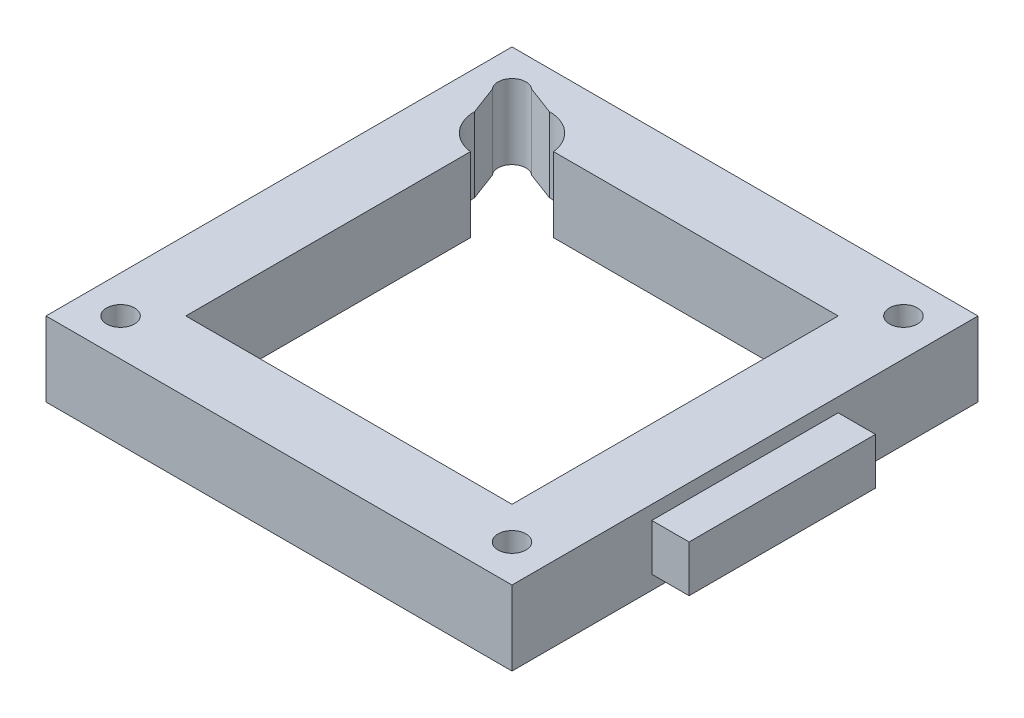
ISO-10303-21;
HEADER;
FILE_DESCRIPTION(('STEP AP214'),'2;1');
FILE_NAME('part.step','',(''),(''),'','','');
FILE_SCHEMA(('AUTOMOTIVE_DESIGN { 1 0 10303 214 1 1 1 1 }'));
ENDSEC;
DATA;
#1=APPLICATION_CONTEXT('core data for automotive mechanical design processes');
#2=APPLICATION_PROTOCOL_DEFINITION('international standard','automotive_design',2000,#1);
#3=PRODUCT_CONTEXT('',#1,'mechanical');
#4=PRODUCT('Part','Part','',(#3));
#5=PRODUCT_RELATED_PRODUCT_CATEGORY('part','',(#4));
#6=PRODUCT_DEFINITION_FORMATION('','',#4);
#7=PRODUCT_DEFINITION_CONTEXT('part definition',#1,'design');
#8=PRODUCT_DEFINITION('design','',#6,#7);
#9=PRODUCT_DEFINITION_SHAPE('','',#8);
#10=(LENGTH_UNIT() NAMED_UNIT(*) SI_UNIT(.MILLI.,.METRE.));
#11=(NAMED_UNIT(*) PLANE_ANGLE_UNIT() SI_UNIT($,.RADIAN.));
#12=(NAMED_UNIT(*) SI_UNIT($,.STERADIAN.) SOLID_ANGLE_UNIT());
#13=UNCERTAINTY_MEASURE_WITH_UNIT(LENGTH_MEASURE(1.E-05),#10,'distance_accuracy_value','');
#14=(GEOMETRIC_REPRESENTATION_CONTEXT(3) GLOBAL_UNCERTAINTY_ASSIGNED_CONTEXT((#13)) GLOBAL_UNIT_ASSIGNED_CONTEXT((#10,
#11,#12)) REPRESENTATION_CONTEXT('',''));
#15=CARTESIAN_POINT('',(0.,0.,0.));
#16=DIRECTION('',(0.,0.,1.));
#17=DIRECTION('',(1.,0.,0.));
#18=AXIS2_PLACEMENT_3D('',#15,#16,#17);
#19=CARTESIAN_POINT('',(25.,8.,0.));
#20=DIRECTION('',(-1.,0.,0.));
#21=DIRECTION('',(0.,0.,1.));
#22=AXIS2_PLACEMENT_3D('',#19,#20,#21);
#23=PLANE('',#22);
#24=DIRECTION('',(0.,0.,-1.));
#25=VECTOR('',#24,1.);
#26=CARTESIAN_POINT('',(25.,0.,0.));
#27=LINE('',#26,#25);
#28=CARTESIAN_POINT('',(25.,0.,25.));
#29=VERTEX_POINT('',#28);
#30=CARTESIAN_POINT('',(25.,0.,-25.));
#31=VERTEX_POINT('',#30);
#32=EDGE_CURVE('E369',#29,#31,#27,.T.);
#33=ORIENTED_EDGE('',*,*,#32,.T.);
#34=DIRECTION('',(0.,-1.,0.));
#35=VECTOR('',#34,1.);
#36=CARTESIAN_POINT('',(25.,8.,-25.));
#37=LINE('',#36,#35);
#38=CARTESIAN_POINT('',(25.,8.,-25.));
#39=VERTEX_POINT('',#38);
#40=EDGE_CURVE('E59',#39,#31,#37,.T.);
#41=ORIENTED_EDGE('',*,*,#40,.F.);
#42=DIRECTION('',(0.,0.,-1.));
#43=VECTOR('',#42,1.);
#44=CARTESIAN_POINT('',(25.,8.,0.));
#45=LINE('',#44,#43);
#46=CARTESIAN_POINT('',(25.,8.,25.));
#47=VERTEX_POINT('',#46);
#48=EDGE_CURVE('E309',#47,#39,#45,.T.);
#49=ORIENTED_EDGE('',*,*,#48,.F.);
#50=DIRECTION('',(0.,-1.,0.));
#51=VECTOR('',#50,1.);
#52=CARTESIAN_POINT('',(25.,8.,25.));
#53=LINE('',#52,#51);
#54=EDGE_CURVE('E11',#47,#29,#53,.T.);
#55=ORIENTED_EDGE('',*,*,#54,.T.);
#56=EDGE_LOOP('',(#33,#41,#49,#55));
#57=FACE_BOUND('',#56,.T.);
#58=DIRECTION('',(0.,0.,-1.));
#59=VECTOR('',#58,1.);
#60=CARTESIAN_POINT('',(25.,1.50000000000004,0.));
#61=LINE('',#60,#59);
#62=CARTESIAN_POINT('',(25.,1.5,10.));
#63=VERTEX_POINT('',#62);
#64=CARTESIAN_POINT('',(25.,1.50000000000007,-10.));
#65=VERTEX_POINT('',#64);
#66=EDGE_CURVE('E67',#63,#65,#61,.T.);
#67=ORIENTED_EDGE('',*,*,#66,.F.);
#68=DIRECTION('',(0.,-1.,0.));
#69=VECTOR('',#68,1.);
#70=CARTESIAN_POINT('',(25.,8.,10.));
#71=LINE('',#70,#69);
#72=CARTESIAN_POINT('',(25.,6.5,10.));
#73=VERTEX_POINT('',#72);
#74=EDGE_CURVE('E71',#73,#63,#71,.T.);
#75=ORIENTED_EDGE('',*,*,#74,.F.);
#76=DIRECTION('',(0.,0.,1.));
#77=VECTOR('',#76,1.);
#78=CARTESIAN_POINT('',(25.,6.5,0.));
#79=LINE('',#78,#77);
#80=CARTESIAN_POINT('',(25.,6.5,-10.));
#81=VERTEX_POINT('',#80);
#82=EDGE_CURVE('E858',#81,#73,#79,.T.);
#83=ORIENTED_EDGE('',*,*,#82,.F.);
#84=DIRECTION('',(0.,1.,0.));
#85=VECTOR('',#84,1.);
#86=CARTESIAN_POINT('',(25.,8.,-10.));
#87=LINE('',#86,#85);
#88=EDGE_CURVE('E868',#65,#81,#87,.T.);
#89=ORIENTED_EDGE('',*,*,#88,.F.);
#90=EDGE_LOOP('',(#67,#75,#83,#89));
#91=FACE_BOUND('',#90,.T.);
#92=ADVANCED_FACE('F49',(#57,#91),#23,.F.);
#93=CARTESIAN_POINT('',(0.,8.,25.));
#94=DIRECTION('',(0.,0.,-1.));
#95=DIRECTION('',(-1.,0.,0.));
#96=AXIS2_PLACEMENT_3D('',#93,#94,#95);
#97=PLANE('',#96);
#98=DIRECTION('',(1.,0.,0.));
#99=VECTOR('',#98,1.);
#100=CARTESIAN_POINT('',(0.,0.,25.));
#101=LINE('',#100,#99);
#102=CARTESIAN_POINT('',(-25.,0.,25.));
#103=VERTEX_POINT('',#102);
#104=EDGE_CURVE('E365',#103,#29,#101,.T.);
#105=ORIENTED_EDGE('',*,*,#104,.T.);
#106=ORIENTED_EDGE('',*,*,#54,.F.);
#107=DIRECTION('',(1.,0.,0.));
#108=VECTOR('',#107,1.);
#109=CARTESIAN_POINT('',(0.,8.,25.));
#110=LINE('',#109,#108);
#111=CARTESIAN_POINT('',(-25.,8.,25.));
#112=VERTEX_POINT('',#111);
#113=EDGE_CURVE('E305',#112,#47,#110,.T.);
#114=ORIENTED_EDGE('',*,*,#113,.F.);
#115=DIRECTION('',(0.,-1.,0.));
#116=VECTOR('',#115,1.);
#117=CARTESIAN_POINT('',(-25.,8.,25.));
#118=LINE('',#117,#116);
#119=EDGE_CURVE('E388',#112,#103,#118,.T.);
#120=ORIENTED_EDGE('',*,*,#119,.T.);
#121=EDGE_LOOP('',(#105,#106,#114,#120));
#122=FACE_BOUND('',#121,.T.);
#123=ADVANCED_FACE('F476',(#122),#97,.F.);
#124=CARTESIAN_POINT('',(0.,8.,-25.));
#125=DIRECTION('',(0.,0.,-1.));
#126=DIRECTION('',(-1.,0.,0.));
#127=AXIS2_PLACEMENT_3D('',#124,#125,#126);
#128=PLANE('',#127);
#129=DIRECTION('',(1.,0.,0.));
#130=VECTOR('',#129,1.);
#131=CARTESIAN_POINT('',(0.,6.5000000000053,-25.));
#132=LINE('',#131,#130);
#133=CARTESIAN_POINT('',(-10.0000000000553,6.5000000000053,-25.));
#134=VERTEX_POINT('',#133);
#135=CARTESIAN_POINT('',(9.9999999999447,6.5000000000053,-25.));
#136=VERTEX_POINT('',#135);
#137=EDGE_CURVE('E218',#134,#136,#132,.T.);
#138=ORIENTED_EDGE('',*,*,#137,.F.);
#139=DIRECTION('',(0.,1.,0.));
#140=VECTOR('',#139,1.);
#141=CARTESIAN_POINT('',(-10.0000000000553,8.,-25.));
#142=LINE('',#141,#140);
#143=CARTESIAN_POINT('',(-10.0000000000553,1.5000000000053,-25.));
#144=VERTEX_POINT('',#143);
#145=EDGE_CURVE('E233',#144,#134,#142,.T.);
#146=ORIENTED_EDGE('',*,*,#145,.F.);
#147=DIRECTION('',(-1.,0.,0.));
#148=VECTOR('',#147,1.);
#149=CARTESIAN_POINT('',(0.,1.5000000000053,-25.));
#150=LINE('',#149,#148);
#151=CARTESIAN_POINT('',(9.9999999999447,1.5000000000053,-25.));
#152=VERTEX_POINT('',#151);
#153=EDGE_CURVE('E249',#152,#144,#150,.T.);
#154=ORIENTED_EDGE('',*,*,#153,.F.);
#155=DIRECTION('',(0.,-1.,0.));
#156=VECTOR('',#155,1.);
#157=CARTESIAN_POINT('',(9.9999999999447,8.,-25.));
#158=LINE('',#157,#156);
#159=EDGE_CURVE('E222',#136,#152,#158,.T.);
#160=ORIENTED_EDGE('',*,*,#159,.F.);
#161=EDGE_LOOP('',(#138,#146,#154,#160));
#162=FACE_BOUND('',#161,.T.);
#163=DIRECTION('',(1.,0.,0.));
#164=VECTOR('',#163,1.);
#165=CARTESIAN_POINT('',(0.,0.,-25.));
#166=LINE('',#165,#164);
#167=CARTESIAN_POINT('',(-25.,0.,-25.));
#168=VERTEX_POINT('',#167);
#169=EDGE_CURVE('E373',#168,#31,#166,.T.);
#170=ORIENTED_EDGE('',*,*,#169,.F.);
#171=DIRECTION('',(0.,-1.,0.));
#172=VECTOR('',#171,1.);
#173=CARTESIAN_POINT('',(-25.,8.,-25.));
#174=LINE('',#173,#172);
#175=CARTESIAN_POINT('',(-25.,8.,-25.));
#176=VERTEX_POINT('',#175);
#177=EDGE_CURVE('E391',#176,#168,#174,.T.);
#178=ORIENTED_EDGE('',*,*,#177,.F.);
#179=DIRECTION('',(1.,0.,0.));
#180=VECTOR('',#179,1.);
#181=CARTESIAN_POINT('',(0.,8.,-25.));
#182=LINE('',#181,#180);
#183=EDGE_CURVE('E312',#176,#39,#182,.T.);
#184=ORIENTED_EDGE('',*,*,#183,.T.);
#185=ORIENTED_EDGE('',*,*,#40,.T.);
#186=EDGE_LOOP('',(#170,#178,#184,#185));
#187=FACE_BOUND('',#186,.T.);
#188=ADVANCED_FACE('F474',(#162,#187),#128,.T.);
#189=CARTESIAN_POINT('',(-17.,8.,-17.));
#190=DIRECTION('',(0.,-1.,0.));
#191=DIRECTION('',(0.,0.,-1.));
#192=AXIS2_PLACEMENT_3D('',#189,#190,#191);
#193=CYLINDRICAL_SURFACE('',#192,4.);
#194=CARTESIAN_POINT('',(-17.,0.,-17.));
#195=DIRECTION('',(0.,1.,0.));
#196=DIRECTION('',(0.,0.,1.));
#197=AXIS2_PLACEMENT_3D('',#194,#195,#196);
#198=CIRCLE('',#197,4.);
#199=CARTESIAN_POINT('',(-13.0313730334031,0.,-17.5));
#200=VERTEX_POINT('',#199);
#201=CARTESIAN_POINT('',(-17.,0.,-21.));
#202=VERTEX_POINT('',#201);
#203=EDGE_CURVE('E259',#200,#202,#198,.T.);
#204=ORIENTED_EDGE('',*,*,#203,.F.);
#205=DIRECTION('',(0.,-1.,0.));
#206=VECTOR('',#205,1.);
#207=CARTESIAN_POINT('',(-13.0313730334031,8.,-17.5));
#208=LINE('',#207,#206);
#209=CARTESIAN_POINT('',(-13.0313730334031,8.,-17.5));
#210=VERTEX_POINT('',#209);
#211=EDGE_CURVE('E53',#210,#200,#208,.T.);
#212=ORIENTED_EDGE('',*,*,#211,.F.);
#213=CARTESIAN_POINT('',(-17.,8.,-17.));
#214=DIRECTION('',(0.,1.,0.));
#215=DIRECTION('',(0.,0.,1.));
#216=AXIS2_PLACEMENT_3D('',#213,#214,#215);
#217=CIRCLE('',#216,4.);
#218=CARTESIAN_POINT('',(-17.,8.,-21.));
#219=VERTEX_POINT('',#218);
#220=EDGE_CURVE('E269',#210,#219,#217,.T.);
#221=ORIENTED_EDGE('',*,*,#220,.T.);
#222=DIRECTION('',(0.,-1.,0.));
#223=VECTOR('',#222,1.);
#224=CARTESIAN_POINT('',(-17.,8.,-21.));
#225=LINE('',#224,#223);
#226=EDGE_CURVE('E328',#219,#202,#225,.T.);
#227=ORIENTED_EDGE('',*,*,#226,.T.);
#228=EDGE_LOOP('',(#204,#212,#221,#227));
#229=FACE_BOUND('',#228,.T.);
#230=ADVANCED_FACE('F426',(#229),#193,.F.);
#231=CARTESIAN_POINT('',(0.,8.,-17.5));
#232=DIRECTION('',(0.,0.,1.));
#233=DIRECTION('',(1.,0.,0.));
#234=AXIS2_PLACEMENT_3D('',#231,#232,#233);
#235=PLANE('',#234);
#236=DIRECTION('',(-1.,0.,0.));
#237=VECTOR('',#236,1.);
#238=CARTESIAN_POINT('',(0.,0.,-17.5));
#239=LINE('',#238,#237);
#240=CARTESIAN_POINT('',(17.5,0.,-17.5));
#241=VERTEX_POINT('',#240);
#242=EDGE_CURVE('E332',#241,#200,#239,.T.);
#243=ORIENTED_EDGE('',*,*,#242,.F.);
#244=DIRECTION('',(0.,-1.,0.));
#245=VECTOR('',#244,1.);
#246=CARTESIAN_POINT('',(17.5,8.,-17.5));
#247=LINE('',#246,#245);
#248=CARTESIAN_POINT('',(17.5,8.,-17.5));
#249=VERTEX_POINT('',#248);
#250=EDGE_CURVE('E415',#249,#241,#247,.T.);
#251=ORIENTED_EDGE('',*,*,#250,.F.);
#252=DIRECTION('',(-1.,0.,0.));
#253=VECTOR('',#252,1.);
#254=CARTESIAN_POINT('',(0.,8.,-17.5));
#255=LINE('',#254,#253);
#256=EDGE_CURVE('E273',#249,#210,#255,.T.);
#257=ORIENTED_EDGE('',*,*,#256,.T.);
#258=ORIENTED_EDGE('',*,*,#211,.T.);
#259=EDGE_LOOP('',(#243,#251,#257,#258));
#260=FACE_BOUND('',#259,.T.);
#261=ADVANCED_FACE('F51',(#260),#235,.T.);
#262=CARTESIAN_POINT('',(17.5,8.,0.));
#263=DIRECTION('',(-1.,0.,0.));
#264=DIRECTION('',(0.,0.,1.));
#265=AXIS2_PLACEMENT_3D('',#262,#263,#264);
#266=PLANE('',#265);
#267=DIRECTION('',(0.,0.,-1.));
#268=VECTOR('',#267,1.);
#269=CARTESIAN_POINT('',(17.5,0.,0.));
#270=LINE('',#269,#268);
#271=CARTESIAN_POINT('',(17.5,0.,17.5));
#272=VERTEX_POINT('',#271);
#273=EDGE_CURVE('E337',#272,#241,#270,.T.);
#274=ORIENTED_EDGE('',*,*,#273,.F.);
#275=DIRECTION('',(0.,-1.,0.));
#276=VECTOR('',#275,1.);
#277=CARTESIAN_POINT('',(17.5,8.,17.5));
#278=LINE('',#277,#276);
#279=CARTESIAN_POINT('',(17.5,8.,17.5));
#280=VERTEX_POINT('',#279);
#281=EDGE_CURVE('E413',#280,#272,#278,.T.);
#282=ORIENTED_EDGE('',*,*,#281,.F.);
#283=DIRECTION('',(0.,0.,-1.));
#284=VECTOR('',#283,1.);
#285=CARTESIAN_POINT('',(17.5,8.,0.));
#286=LINE('',#285,#284);
#287=EDGE_CURVE('E279',#280,#249,#286,.T.);
#288=ORIENTED_EDGE('',*,*,#287,.T.);
#289=ORIENTED_EDGE('',*,*,#250,.T.);
#290=EDGE_LOOP('',(#274,#282,#288,#289));
#291=FACE_BOUND('',#290,.T.);
#292=ADVANCED_FACE('F434',(#291),#266,.T.);
#293=CARTESIAN_POINT('',(0.,8.,17.5));
#294=DIRECTION('',(0.,0.,-1.));
#295=DIRECTION('',(-1.,0.,0.));
#296=AXIS2_PLACEMENT_3D('',#293,#294,#295);
#297=PLANE('',#296);
#298=DIRECTION('',(1.,0.,0.));
#299=VECTOR('',#298,1.);
#300=CARTESIAN_POINT('',(0.,0.,17.5));
#301=LINE('',#300,#299);
#302=CARTESIAN_POINT('',(-17.5,0.,17.5));
#303=VERTEX_POINT('',#302);
#304=EDGE_CURVE('E341',#303,#272,#301,.T.);
#305=ORIENTED_EDGE('',*,*,#304,.F.);
#306=DIRECTION('',(0.,-1.,0.));
#307=VECTOR('',#306,1.);
#308=CARTESIAN_POINT('',(-17.5,8.,17.5));
#309=LINE('',#308,#307);
#310=CARTESIAN_POINT('',(-17.5,8.,17.5));
#311=VERTEX_POINT('',#310);
#312=EDGE_CURVE('E410',#311,#303,#309,.T.);
#313=ORIENTED_EDGE('',*,*,#312,.F.);
#314=DIRECTION('',(1.,0.,0.));
#315=VECTOR('',#314,1.);
#316=CARTESIAN_POINT('',(0.,8.,17.5));
#317=LINE('',#316,#315);
#318=EDGE_CURVE('E283',#311,#280,#317,.T.);
#319=ORIENTED_EDGE('',*,*,#318,.T.);
#320=ORIENTED_EDGE('',*,*,#281,.T.);
#321=EDGE_LOOP('',(#305,#313,#319,#320));
#322=FACE_BOUND('',#321,.T.);
#323=ADVANCED_FACE('F441',(#322),#297,.T.);
#324=CARTESIAN_POINT('',(-17.5,8.,0.));
#325=DIRECTION('',(-1.,0.,0.));
#326=DIRECTION('',(0.,0.,1.));
#327=AXIS2_PLACEMENT_3D('',#324,#325,#326);
#328=PLANE('',#327);
#329=DIRECTION('',(0.,0.,-1.));
#330=VECTOR('',#329,1.);
#331=CARTESIAN_POINT('',(-17.5,0.,0.));
#332=LINE('',#331,#330);
#333=CARTESIAN_POINT('',(-17.5,0.,-13.0313730334031));
#334=VERTEX_POINT('',#333);
#335=EDGE_CURVE('E345',#303,#334,#332,.T.);
#336=ORIENTED_EDGE('',*,*,#335,.T.);
#337=DIRECTION('',(0.,-1.,0.));
#338=VECTOR('',#337,1.);
#339=CARTESIAN_POINT('',(-17.5,8.,-13.0313730334031));
#340=LINE('',#339,#338);
#341=CARTESIAN_POINT('',(-17.5,8.,-13.0313730334031));
#342=VERTEX_POINT('',#341);
#343=EDGE_CURVE('E407',#342,#334,#340,.T.);
#344=ORIENTED_EDGE('',*,*,#343,.F.);
#345=DIRECTION('',(0.,0.,-1.));
#346=VECTOR('',#345,1.);
#347=CARTESIAN_POINT('',(-17.5,8.,0.));
#348=LINE('',#347,#346);
#349=EDGE_CURVE('E287',#311,#342,#348,.T.);
#350=ORIENTED_EDGE('',*,*,#349,.F.);
#351=ORIENTED_EDGE('',*,*,#312,.T.);
#352=EDGE_LOOP('',(#336,#344,#350,#351));
#353=FACE_BOUND('',#352,.T.);
#354=ADVANCED_FACE('F445',(#353),#328,.F.);
#355=CARTESIAN_POINT('',(-21.,0.,-17.));
#356=VERTEX_POINT('',#355);
#357=EDGE_CURVE('E333',#356,#334,#198,.T.);
#358=ORIENTED_EDGE('',*,*,#357,.F.);
#359=DIRECTION('',(0.,-1.,0.));
#360=VECTOR('',#359,1.);
#361=CARTESIAN_POINT('',(-21.,8.,-17.));
#362=LINE('',#361,#360);
#363=CARTESIAN_POINT('',(-21.,8.,-17.));
#364=VERTEX_POINT('',#363);
#365=EDGE_CURVE('E404',#364,#356,#362,.T.);
#366=ORIENTED_EDGE('',*,*,#365,.F.);
#367=EDGE_CURVE('E275',#364,#342,#217,.T.);
#368=ORIENTED_EDGE('',*,*,#367,.T.);
#369=ORIENTED_EDGE('',*,*,#343,.T.);
#370=EDGE_LOOP('',(#358,#366,#368,#369));
#371=FACE_BOUND('',#370,.T.);
#372=ADVANCED_FACE('F464',(#371),#193,.F.);
#373=CARTESIAN_POINT('',(-12.8219178082192,8.,4.80821917808219));
#374=DIRECTION('',(0.936329177569045,0.,-0.351123441588392));
#375=DIRECTION('',(-0.351123441588392,0.,-0.936329177569045));
#376=AXIS2_PLACEMENT_3D('',#373,#374,#375);
#377=PLANE('',#376);
#378=DIRECTION('',(0.351123441588392,0.,0.936329177569044));
#379=VECTOR('',#378,1.);
#380=CARTESIAN_POINT('',(-12.8219178082192,0.,4.80821917808219));
#381=LINE('',#380,#379);
#382=CARTESIAN_POINT('',(-22.1301369863014,0.,-20.013698630137));
#383=VERTEX_POINT('',#382);
#384=EDGE_CURVE('E349',#383,#356,#381,.T.);
#385=ORIENTED_EDGE('',*,*,#384,.F.);
#386=DIRECTION('',(0.,-1.,0.));
#387=VECTOR('',#386,1.);
#388=CARTESIAN_POINT('',(-22.1301369863014,8.,-20.013698630137));
#389=LINE('',#388,#387);
#390=CARTESIAN_POINT('',(-22.1301369863014,8.,-20.013698630137));
#391=VERTEX_POINT('',#390);
#392=EDGE_CURVE('E401',#391,#383,#389,.T.);
#393=ORIENTED_EDGE('',*,*,#392,.F.);
#394=DIRECTION('',(0.351123441588392,0.,0.936329177569044));
#395=VECTOR('',#394,1.);
#396=CARTESIAN_POINT('',(-12.8219178082192,8.,4.80821917808219));
#397=LINE('',#396,#395);
#398=EDGE_CURVE('E290',#391,#364,#397,.T.);
#399=ORIENTED_EDGE('',*,*,#398,.T.);
#400=ORIENTED_EDGE('',*,*,#365,.T.);
#401=EDGE_LOOP('',(#385,#393,#399,#400));
#402=FACE_BOUND('',#401,.T.);
#403=ADVANCED_FACE('F454',(#402),#377,.T.);
#404=CARTESIAN_POINT('',(-21.,8.,-21.));
#405=DIRECTION('',(0.,-1.,0.));
#406=DIRECTION('',(0.,0.,-1.));
#407=AXIS2_PLACEMENT_3D('',#404,#405,#406);
#408=CYLINDRICAL_SURFACE('',#407,1.5);
#409=CARTESIAN_POINT('',(-21.,0.,-21.));
#410=DIRECTION('',(0.,1.,0.));
#411=DIRECTION('',(0.,0.,1.));
#412=AXIS2_PLACEMENT_3D('',#409,#410,#411);
#413=CIRCLE('',#412,1.5);
#414=CARTESIAN_POINT('',(-20.013698630137,0.,-22.1301369863014));
#415=VERTEX_POINT('',#414);
#416=EDGE_CURVE('E353',#415,#383,#413,.T.);
#417=ORIENTED_EDGE('',*,*,#416,.F.);
#418=DIRECTION('',(0.,-1.,0.));
#419=VECTOR('',#418,1.);
#420=CARTESIAN_POINT('',(-20.013698630137,8.,-22.1301369863014));
#421=LINE('',#420,#419);
#422=CARTESIAN_POINT('',(-20.013698630137,8.,-22.1301369863014));
#423=VERTEX_POINT('',#422);
#424=EDGE_CURVE('E398',#423,#415,#421,.T.);
#425=ORIENTED_EDGE('',*,*,#424,.F.);
#426=CARTESIAN_POINT('',(-21.,8.,-21.));
#427=DIRECTION('',(0.,1.,0.));
#428=DIRECTION('',(0.,0.,1.));
#429=AXIS2_PLACEMENT_3D('',#426,#427,#428);
#430=CIRCLE('',#429,1.5);
#431=EDGE_CURVE('E294',#423,#391,#430,.T.);
#432=ORIENTED_EDGE('',*,*,#431,.T.);
#433=ORIENTED_EDGE('',*,*,#392,.T.);
#434=EDGE_LOOP('',(#417,#425,#432,#433));
#435=FACE_BOUND('',#434,.T.);
#436=ADVANCED_FACE('F458',(#435),#408,.F.);
#437=CARTESIAN_POINT('',(21.,8.,21.));
#438=DIRECTION('',(0.,-1.,0.));
#439=DIRECTION('',(0.,0.,-1.));
#440=AXIS2_PLACEMENT_3D('',#437,#438,#439);
#441=CYLINDRICAL_SURFACE('',#440,1.5);
#442=CARTESIAN_POINT('',(21.,8.,21.));
#443=DIRECTION('',(0.,1.,0.));
#444=DIRECTION('',(0.,0.,1.));
#445=AXIS2_PLACEMENT_3D('',#442,#443,#444);
#446=CIRCLE('',#445,1.5);
#447=CARTESIAN_POINT('',(21.,8.,22.5));
#448=VERTEX_POINT('',#447);
#449=EDGE_CURVE('E320',#448,#448,#446,.T.);
#450=ORIENTED_EDGE('',*,*,#449,.T.);
#451=EDGE_LOOP('',(#450));
#452=FACE_BOUND('',#451,.T.);
#453=CARTESIAN_POINT('',(21.,0.,21.));
#454=DIRECTION('',(0.,1.,0.));
#455=DIRECTION('',(0.,0.,1.));
#456=AXIS2_PLACEMENT_3D('',#453,#454,#455);
#457=CIRCLE('',#456,1.5);
#458=CARTESIAN_POINT('',(21.,0.,22.5));
#459=VERTEX_POINT('',#458);
#460=EDGE_CURVE('E381',#459,#459,#457,.T.);
#461=ORIENTED_EDGE('',*,*,#460,.F.);
#462=EDGE_LOOP('',(#461));
#463=FACE_BOUND('',#462,.T.);
#464=ADVANCED_FACE('F498',(#452,#463),#441,.F.);
#465=CARTESIAN_POINT('',(-25.,8.,0.));
#466=DIRECTION('',(-1.,0.,0.));
#467=DIRECTION('',(0.,0.,1.));
#468=AXIS2_PLACEMENT_3D('',#465,#466,#467);
#469=PLANE('',#468);
#470=DIRECTION('',(0.,0.,-1.));
#471=VECTOR('',#470,1.);
#472=CARTESIAN_POINT('',(-25.,0.,0.));
#473=LINE('',#472,#471);
#474=EDGE_CURVE('E377',#103,#168,#473,.T.);
#475=ORIENTED_EDGE('',*,*,#474,.F.);
#476=ORIENTED_EDGE('',*,*,#119,.F.);
#477=DIRECTION('',(0.,0.,-1.));
#478=VECTOR('',#477,1.);
#479=CARTESIAN_POINT('',(-25.,8.,0.));
#480=LINE('',#479,#478);
#481=EDGE_CURVE('E316',#112,#176,#480,.T.);
#482=ORIENTED_EDGE('',*,*,#481,.T.);
#483=ORIENTED_EDGE('',*,*,#177,.T.);
#484=EDGE_LOOP('',(#475,#476,#482,#483));
#485=FACE_BOUND('',#484,.T.);
#486=ADVANCED_FACE('F492',(#485),#469,.T.);
#487=CARTESIAN_POINT('',(21.,8.,-21.));
#488=DIRECTION('',(0.,-1.,0.));
#489=DIRECTION('',(0.,0.,-1.));
#490=AXIS2_PLACEMENT_3D('',#487,#488,#489);
#491=CYLINDRICAL_SURFACE('',#490,1.5);
#492=CARTESIAN_POINT('',(21.,8.,-21.));
#493=DIRECTION('',(0.,1.,0.));
#494=DIRECTION('',(0.,0.,1.));
#495=AXIS2_PLACEMENT_3D('',#492,#493,#494);
#496=CIRCLE('',#495,1.5);
#497=CARTESIAN_POINT('',(21.,8.,-19.5));
#498=VERTEX_POINT('',#497);
#499=EDGE_CURVE('E301',#498,#498,#496,.F.);
#500=ORIENTED_EDGE('',*,*,#499,.F.);
#501=EDGE_LOOP('',(#500));
#502=FACE_BOUND('',#501,.T.);
#503=CARTESIAN_POINT('',(21.,0.,-21.));
#504=DIRECTION('',(0.,1.,0.));
#505=DIRECTION('',(0.,0.,1.));
#506=AXIS2_PLACEMENT_3D('',#503,#504,#505);
#507=CIRCLE('',#506,1.5);
#508=CARTESIAN_POINT('',(21.,0.,-19.5));
#509=VERTEX_POINT('',#508);
#510=EDGE_CURVE('E361',#509,#509,#507,.F.);
#511=ORIENTED_EDGE('',*,*,#510,.T.);
#512=EDGE_LOOP('',(#511));
#513=FACE_BOUND('',#512,.T.);
#514=ADVANCED_FACE('F489',(#502,#513),#491,.F.);
#515=CARTESIAN_POINT('',(4.80821917808219,8.,-12.8219178082192));
#516=DIRECTION('',(0.351123441588392,0.,-0.936329177569045));
#517=DIRECTION('',(-0.936329177569045,0.,-0.351123441588392));
#518=AXIS2_PLACEMENT_3D('',#515,#516,#517);
#519=PLANE('',#518);
#520=DIRECTION('',(0.936329177569044,0.,0.351123441588392));
#521=VECTOR('',#520,1.);
#522=CARTESIAN_POINT('',(4.80821917808219,0.,-12.8219178082192));
#523=LINE('',#522,#521);
#524=EDGE_CURVE('E357',#415,#202,#523,.T.);
#525=ORIENTED_EDGE('',*,*,#524,.T.);
#526=ORIENTED_EDGE('',*,*,#226,.F.);
#527=DIRECTION('',(0.936329177569044,0.,0.351123441588392));
#528=VECTOR('',#527,1.);
#529=CARTESIAN_POINT('',(4.80821917808219,8.,-12.8219178082192));
#530=LINE('',#529,#528);
#531=EDGE_CURVE('E298',#423,#219,#530,.T.);
#532=ORIENTED_EDGE('',*,*,#531,.F.);
#533=ORIENTED_EDGE('',*,*,#424,.T.);
#534=EDGE_LOOP('',(#525,#526,#532,#533));
#535=FACE_BOUND('',#534,.T.);
#536=ADVANCED_FACE('F461',(#535),#519,.F.);
#537=CARTESIAN_POINT('',(-21.,8.,21.));
#538=DIRECTION('',(0.,-1.,0.));
#539=DIRECTION('',(0.,0.,-1.));
#540=AXIS2_PLACEMENT_3D('',#537,#538,#539);
#541=CYLINDRICAL_SURFACE('',#540,1.5);
#542=CARTESIAN_POINT('',(-21.,8.,21.));
#543=DIRECTION('',(0.,1.,0.));
#544=DIRECTION('',(0.,0.,1.));
#545=AXIS2_PLACEMENT_3D('',#542,#543,#544);
#546=CIRCLE('',#545,1.5);
#547=CARTESIAN_POINT('',(-21.,8.,22.5));
#548=VERTEX_POINT('',#547);
#549=EDGE_CURVE('E324',#548,#548,#546,.F.);
#550=ORIENTED_EDGE('',*,*,#549,.F.);
#551=EDGE_LOOP('',(#550));
#552=FACE_BOUND('',#551,.T.);
#553=CARTESIAN_POINT('',(-21.,0.,21.));
#554=DIRECTION('',(0.,1.,0.));
#555=DIRECTION('',(0.,0.,1.));
#556=AXIS2_PLACEMENT_3D('',#553,#554,#555);
#557=CIRCLE('',#556,1.5);
#558=CARTESIAN_POINT('',(-21.,0.,22.5));
#559=VERTEX_POINT('',#558);
#560=EDGE_CURVE('E274',#559,#559,#557,.F.);
#561=ORIENTED_EDGE('',*,*,#560,.T.);
#562=EDGE_LOOP('',(#561));
#563=FACE_BOUND('',#562,.T.);
#564=ADVANCED_FACE('F496',(#552,#563),#541,.F.);
#565=CARTESIAN_POINT('',(0.,8.,0.));
#566=DIRECTION('',(0.,1.,0.));
#567=DIRECTION('',(0.,0.,1.));
#568=AXIS2_PLACEMENT_3D('',#565,#566,#567);
#569=PLANE('',#568);
#570=ORIENTED_EDGE('',*,*,#220,.F.);
#571=ORIENTED_EDGE('',*,*,#256,.F.);
#572=ORIENTED_EDGE('',*,*,#287,.F.);
#573=ORIENTED_EDGE('',*,*,#318,.F.);
#574=ORIENTED_EDGE('',*,*,#349,.T.);
#575=ORIENTED_EDGE('',*,*,#367,.F.);
#576=ORIENTED_EDGE('',*,*,#398,.F.);
#577=ORIENTED_EDGE('',*,*,#431,.F.);
#578=ORIENTED_EDGE('',*,*,#531,.T.);
#579=EDGE_LOOP('',(#570,#571,#572,#573,#574,#575,#576,#577,#578));
#580=FACE_BOUND('',#579,.T.);
#581=ORIENTED_EDGE('',*,*,#499,.T.);
#582=EDGE_LOOP('',(#581));
#583=FACE_BOUND('',#582,.T.);
#584=ORIENTED_EDGE('',*,*,#113,.T.);
#585=ORIENTED_EDGE('',*,*,#48,.T.);
#586=ORIENTED_EDGE('',*,*,#183,.F.);
#587=ORIENTED_EDGE('',*,*,#481,.F.);
#588=EDGE_LOOP('',(#584,#585,#586,#587));
#589=FACE_BOUND('',#588,.T.);
#590=ORIENTED_EDGE('',*,*,#449,.F.);
#591=EDGE_LOOP('',(#590));
#592=FACE_BOUND('',#591,.T.);
#593=ORIENTED_EDGE('',*,*,#549,.T.);
#594=EDGE_LOOP('',(#593));
#595=FACE_BOUND('',#594,.T.);
#596=ADVANCED_FACE('F439',(#580,#583,#589,#592,#595),#569,.T.);
#597=CARTESIAN_POINT('',(0.,0.,0.));
#598=DIRECTION('',(0.,1.,0.));
#599=DIRECTION('',(0.,0.,1.));
#600=AXIS2_PLACEMENT_3D('',#597,#598,#599);
#601=PLANE('',#600);
#602=ORIENTED_EDGE('',*,*,#203,.T.);
#603=ORIENTED_EDGE('',*,*,#524,.F.);
#604=ORIENTED_EDGE('',*,*,#416,.T.);
#605=ORIENTED_EDGE('',*,*,#384,.T.);
#606=ORIENTED_EDGE('',*,*,#357,.T.);
#607=ORIENTED_EDGE('',*,*,#335,.F.);
#608=ORIENTED_EDGE('',*,*,#304,.T.);
#609=ORIENTED_EDGE('',*,*,#273,.T.);
#610=ORIENTED_EDGE('',*,*,#242,.T.);
#611=EDGE_LOOP('',(#602,#603,#604,#605,#606,#607,#608,#609,#610));
#612=FACE_BOUND('',#611,.T.);
#613=ORIENTED_EDGE('',*,*,#510,.F.);
#614=EDGE_LOOP('',(#613));
#615=FACE_BOUND('',#614,.T.);
#616=ORIENTED_EDGE('',*,*,#104,.F.);
#617=ORIENTED_EDGE('',*,*,#474,.T.);
#618=ORIENTED_EDGE('',*,*,#169,.T.);
#619=ORIENTED_EDGE('',*,*,#32,.F.);
#620=EDGE_LOOP('',(#616,#617,#618,#619));
#621=FACE_BOUND('',#620,.T.);
#622=ORIENTED_EDGE('',*,*,#460,.T.);
#623=EDGE_LOOP('',(#622));
#624=FACE_BOUND('',#623,.T.);
#625=ORIENTED_EDGE('',*,*,#560,.F.);
#626=EDGE_LOOP('',(#625));
#627=FACE_BOUND('',#626,.T.);
#628=ADVANCED_FACE('F430',(#612,#615,#621,#624,#627),#601,.F.);
#629=CARTESIAN_POINT('',(0.,6.5000000000053,-21.));
#630=DIRECTION('',(0.,1.,0.));
#631=DIRECTION('',(0.,0.,1.));
#632=AXIS2_PLACEMENT_3D('',#629,#630,#631);
#633=PLANE('',#632);
#634=ORIENTED_EDGE('',*,*,#137,.T.);
#635=DIRECTION('',(0.,0.,-1.));
#636=VECTOR('',#635,1.);
#637=CARTESIAN_POINT('',(9.9999999999447,6.5000000000053,-21.));
#638=LINE('',#637,#636);
#639=CARTESIAN_POINT('',(9.9999999999447,6.5000000000053,-21.));
#640=VERTEX_POINT('',#639);
#641=EDGE_CURVE('E244',#640,#136,#638,.T.);
#642=ORIENTED_EDGE('',*,*,#641,.F.);
#643=DIRECTION('',(1.,0.,0.));
#644=VECTOR('',#643,1.);
#645=CARTESIAN_POINT('',(0.,6.5000000000053,-21.));
#646=LINE('',#645,#644);
#647=CARTESIAN_POINT('',(-10.0000000000553,6.5000000000053,-21.));
#648=VERTEX_POINT('',#647);
#649=EDGE_CURVE('E228',#648,#640,#646,.T.);
#650=ORIENTED_EDGE('',*,*,#649,.F.);
#651=DIRECTION('',(0.,0.,-1.));
#652=VECTOR('',#651,1.);
#653=CARTESIAN_POINT('',(-10.0000000000553,6.5000000000053,-21.));
#654=LINE('',#653,#652);
#655=EDGE_CURVE('E256',#648,#134,#654,.T.);
#656=ORIENTED_EDGE('',*,*,#655,.T.);
#657=EDGE_LOOP('',(#634,#642,#650,#656));
#658=FACE_BOUND('',#657,.T.);
#659=ADVANCED_FACE('F515',(#658),#633,.F.);
#660=CARTESIAN_POINT('',(-10.0000000000553,8.,-21.));
#661=DIRECTION('',(-1.,0.,0.));
#662=DIRECTION('',(0.,0.,1.));
#663=AXIS2_PLACEMENT_3D('',#660,#661,#662);
#664=PLANE('',#663);
#665=ORIENTED_EDGE('',*,*,#145,.T.);
#666=ORIENTED_EDGE('',*,*,#655,.F.);
#667=DIRECTION('',(0.,1.,0.));
#668=VECTOR('',#667,1.);
#669=CARTESIAN_POINT('',(-10.0000000000553,8.,-21.));
#670=LINE('',#669,#668);
#671=CARTESIAN_POINT('',(-10.0000000000553,1.5000000000053,-21.));
#672=VERTEX_POINT('',#671);
#673=EDGE_CURVE('E241',#672,#648,#670,.T.);
#674=ORIENTED_EDGE('',*,*,#673,.F.);
#675=DIRECTION('',(0.,0.,-1.));
#676=VECTOR('',#675,1.);
#677=CARTESIAN_POINT('',(-10.0000000000553,1.5000000000053,-21.));
#678=LINE('',#677,#676);
#679=EDGE_CURVE('E260',#672,#144,#678,.T.);
#680=ORIENTED_EDGE('',*,*,#679,.T.);
#681=EDGE_LOOP('',(#665,#666,#674,#680));
#682=FACE_BOUND('',#681,.T.);
#683=ADVANCED_FACE('F520',(#682),#664,.F.);
#684=CARTESIAN_POINT('',(0.,1.5000000000053,-21.));
#685=DIRECTION('',(0.,-1.,0.));
#686=DIRECTION('',(0.,0.,-1.));
#687=AXIS2_PLACEMENT_3D('',#684,#685,#686);
#688=PLANE('',#687);
#689=ORIENTED_EDGE('',*,*,#153,.T.);
#690=ORIENTED_EDGE('',*,*,#679,.F.);
#691=DIRECTION('',(-1.,0.,0.));
#692=VECTOR('',#691,1.);
#693=CARTESIAN_POINT('',(0.,1.5000000000053,-21.));
#694=LINE('',#693,#692);
#695=CARTESIAN_POINT('',(9.9999999999447,1.5000000000053,-21.));
#696=VERTEX_POINT('',#695);
#697=EDGE_CURVE('E237',#696,#672,#694,.T.);
#698=ORIENTED_EDGE('',*,*,#697,.F.);
#699=DIRECTION('',(0.,0.,-1.));
#700=VECTOR('',#699,1.);
#701=CARTESIAN_POINT('',(9.9999999999447,1.5000000000053,-21.));
#702=LINE('',#701,#700);
#703=EDGE_CURVE('E263',#696,#152,#702,.T.);
#704=ORIENTED_EDGE('',*,*,#703,.T.);
#705=EDGE_LOOP('',(#689,#690,#698,#704));
#706=FACE_BOUND('',#705,.T.);
#707=ADVANCED_FACE('F526',(#706),#688,.F.);
#708=CARTESIAN_POINT('',(9.9999999999447,8.,-21.));
#709=DIRECTION('',(1.,0.,0.));
#710=DIRECTION('',(0.,0.,-1.));
#711=AXIS2_PLACEMENT_3D('',#708,#709,#710);
#712=PLANE('',#711);
#713=ORIENTED_EDGE('',*,*,#159,.T.);
#714=ORIENTED_EDGE('',*,*,#703,.F.);
#715=DIRECTION('',(0.,-1.,0.));
#716=VECTOR('',#715,1.);
#717=CARTESIAN_POINT('',(9.9999999999447,8.,-21.));
#718=LINE('',#717,#716);
#719=EDGE_CURVE('E232',#640,#696,#718,.T.);
#720=ORIENTED_EDGE('',*,*,#719,.F.);
#721=ORIENTED_EDGE('',*,*,#641,.T.);
#722=EDGE_LOOP('',(#713,#714,#720,#721));
#723=FACE_BOUND('',#722,.T.);
#724=ADVANCED_FACE('F522',(#723),#712,.F.);
#725=CARTESIAN_POINT('',(0.,0.,-21.));
#726=DIRECTION('',(0.,0.,-1.));
#727=DIRECTION('',(-1.,0.,0.));
#728=AXIS2_PLACEMENT_3D('',#725,#726,#727);
#729=PLANE('',#728);
#730=ORIENTED_EDGE('',*,*,#649,.T.);
#731=ORIENTED_EDGE('',*,*,#719,.T.);
#732=ORIENTED_EDGE('',*,*,#697,.T.);
#733=ORIENTED_EDGE('',*,*,#673,.T.);
#734=EDGE_LOOP('',(#730,#731,#732,#733));
#735=FACE_BOUND('',#734,.T.);
#736=ADVANCED_FACE('F525',(#735),#729,.T.);
#737=CARTESIAN_POINT('',(29.,1.50000000000004,0.));
#738=DIRECTION('',(0.,1.,0.));
#739=DIRECTION('',(0.,0.,1.));
#740=AXIS2_PLACEMENT_3D('',#737,#738,#739);
#741=PLANE('',#740);
#742=ORIENTED_EDGE('',*,*,#66,.T.);
#743=DIRECTION('',(-1.,0.,0.));
#744=VECTOR('',#743,1.);
#745=CARTESIAN_POINT('',(29.,1.50000000000007,-10.));
#746=LINE('',#745,#744);
#747=CARTESIAN_POINT('',(29.,1.50000000000007,-10.));
#748=VERTEX_POINT('',#747);
#749=EDGE_CURVE('E198',#748,#65,#746,.T.);
#750=ORIENTED_EDGE('',*,*,#749,.F.);
#751=DIRECTION('',(0.,0.,-1.));
#752=VECTOR('',#751,1.);
#753=CARTESIAN_POINT('',(29.,1.50000000000004,0.));
#754=LINE('',#753,#752);
#755=CARTESIAN_POINT('',(29.,1.5,10.));
#756=VERTEX_POINT('',#755);
#757=EDGE_CURVE('E205',#756,#748,#754,.T.);
#758=ORIENTED_EDGE('',*,*,#757,.F.);
#759=DIRECTION('',(-1.,0.,0.));
#760=VECTOR('',#759,1.);
#761=CARTESIAN_POINT('',(29.,1.5,10.));
#762=LINE('',#761,#760);
#763=EDGE_CURVE('E855',#756,#63,#762,.T.);
#764=ORIENTED_EDGE('',*,*,#763,.T.);
#765=EDGE_LOOP('',(#742,#750,#758,#764));
#766=FACE_BOUND('',#765,.T.);
#767=ADVANCED_FACE('F216',(#766),#741,.F.);
#768=CARTESIAN_POINT('',(29.,8.,-10.));
#769=DIRECTION('',(0.,0.,1.));
#770=DIRECTION('',(1.,0.,0.));
#771=AXIS2_PLACEMENT_3D('',#768,#769,#770);
#772=PLANE('',#771);
#773=ORIENTED_EDGE('',*,*,#88,.T.);
#774=DIRECTION('',(-1.,0.,0.));
#775=VECTOR('',#774,1.);
#776=CARTESIAN_POINT('',(29.,6.5,-10.));
#777=LINE('',#776,#775);
#778=CARTESIAN_POINT('',(29.,6.5,-10.));
#779=VERTEX_POINT('',#778);
#780=EDGE_CURVE('E200',#779,#81,#777,.T.);
#781=ORIENTED_EDGE('',*,*,#780,.F.);
#782=DIRECTION('',(0.,1.,0.));
#783=VECTOR('',#782,1.);
#784=CARTESIAN_POINT('',(29.,8.,-10.));
#785=LINE('',#784,#783);
#786=EDGE_CURVE('E193',#748,#779,#785,.T.);
#787=ORIENTED_EDGE('',*,*,#786,.F.);
#788=ORIENTED_EDGE('',*,*,#749,.T.);
#789=EDGE_LOOP('',(#773,#781,#787,#788));
#790=FACE_BOUND('',#789,.T.);
#791=ADVANCED_FACE('F196',(#790),#772,.F.);
#792=CARTESIAN_POINT('',(29.,6.5,0.));
#793=DIRECTION('',(0.,-1.,0.));
#794=DIRECTION('',(0.,0.,-1.));
#795=AXIS2_PLACEMENT_3D('',#792,#793,#794);
#796=PLANE('',#795);
#797=ORIENTED_EDGE('',*,*,#82,.T.);
#798=DIRECTION('',(-1.,0.,0.));
#799=VECTOR('',#798,1.);
#800=CARTESIAN_POINT('',(29.,6.5,10.));
#801=LINE('',#800,#799);
#802=CARTESIAN_POINT('',(29.,6.5,10.));
#803=VERTEX_POINT('',#802);
#804=EDGE_CURVE('E224',#803,#73,#801,.T.);
#805=ORIENTED_EDGE('',*,*,#804,.F.);
#806=DIRECTION('',(0.,0.,1.));
#807=VECTOR('',#806,1.);
#808=CARTESIAN_POINT('',(29.,6.5,0.));
#809=LINE('',#808,#807);
#810=EDGE_CURVE('E204',#779,#803,#809,.T.);
#811=ORIENTED_EDGE('',*,*,#810,.F.);
#812=ORIENTED_EDGE('',*,*,#780,.T.);
#813=EDGE_LOOP('',(#797,#805,#811,#812));
#814=FACE_BOUND('',#813,.T.);
#815=ADVANCED_FACE('F541',(#814),#796,.F.);
#816=CARTESIAN_POINT('',(29.,8.,10.));
#817=DIRECTION('',(0.,0.,-1.));
#818=DIRECTION('',(-1.,0.,0.));
#819=AXIS2_PLACEMENT_3D('',#816,#817,#818);
#820=PLANE('',#819);
#821=ORIENTED_EDGE('',*,*,#74,.T.);
#822=ORIENTED_EDGE('',*,*,#763,.F.);
#823=DIRECTION('',(0.,-1.,0.));
#824=VECTOR('',#823,1.);
#825=CARTESIAN_POINT('',(29.,8.,10.));
#826=LINE('',#825,#824);
#827=EDGE_CURVE('E210',#803,#756,#826,.T.);
#828=ORIENTED_EDGE('',*,*,#827,.F.);
#829=ORIENTED_EDGE('',*,*,#804,.T.);
#830=EDGE_LOOP('',(#821,#822,#828,#829));
#831=FACE_BOUND('',#830,.T.);
#832=ADVANCED_FACE('F544',(#831),#820,.F.);
#833=CARTESIAN_POINT('',(29.,0.,0.));
#834=DIRECTION('',(1.,0.,0.));
#835=DIRECTION('',(0.,0.,-1.));
#836=AXIS2_PLACEMENT_3D('',#833,#834,#835);
#837=PLANE('',#836);
#838=ORIENTED_EDGE('',*,*,#757,.T.);
#839=ORIENTED_EDGE('',*,*,#786,.T.);
#840=ORIENTED_EDGE('',*,*,#810,.T.);
#841=ORIENTED_EDGE('',*,*,#827,.T.);
#842=EDGE_LOOP('',(#838,#839,#840,#841));
#843=FACE_BOUND('',#842,.T.);
#844=ADVANCED_FACE('F208',(#843),#837,.T.);
#845=CLOSED_SHELL('',(#92,#123,#188,#230,#261,#292,#323,#354,#372,#403,#436,#464,#486,#514,#536,
#564,#596,#628,#659,#683,#707,#724,#736,#767,#791,#815,#832,#844));
#846=MANIFOLD_SOLID_BREP('B2',#845);
#847=ADVANCED_BREP_SHAPE_REPRESENTATION('',(#18,#846),#14);
#848=SHAPE_DEFINITION_REPRESENTATION(#9,#847);
ENDSEC;
END-ISO-10303-21;
